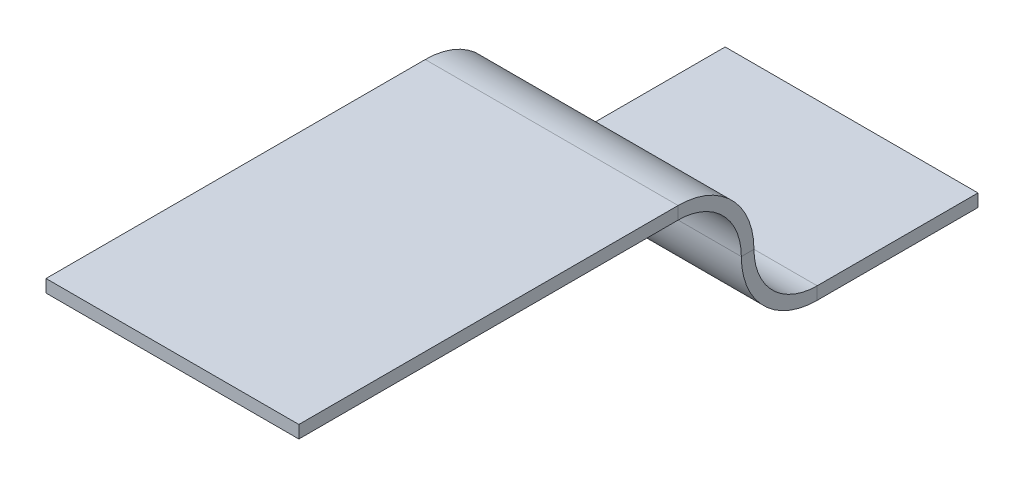
ISO-10303-21;
HEADER;
FILE_DESCRIPTION(('STEP AP214'),'2;1');
FILE_NAME('part.step','',(''),(''),'','','');
FILE_SCHEMA(('AUTOMOTIVE_DESIGN { 1 0 10303 214 1 1 1 1 }'));
ENDSEC;
DATA;
#1=APPLICATION_CONTEXT('core data for automotive mechanical design processes');
#2=APPLICATION_PROTOCOL_DEFINITION('international standard','automotive_design',2000,#1);
#3=PRODUCT_CONTEXT('',#1,'mechanical');
#4=PRODUCT('Part','Part','',(#3));
#5=PRODUCT_RELATED_PRODUCT_CATEGORY('part','',(#4));
#6=PRODUCT_DEFINITION_FORMATION('','',#4);
#7=PRODUCT_DEFINITION_CONTEXT('part definition',#1,'design');
#8=PRODUCT_DEFINITION('design','',#6,#7);
#9=PRODUCT_DEFINITION_SHAPE('','',#8);
#10=(LENGTH_UNIT() NAMED_UNIT(*) SI_UNIT(.MILLI.,.METRE.));
#11=(NAMED_UNIT(*) PLANE_ANGLE_UNIT() SI_UNIT($,.RADIAN.));
#12=(NAMED_UNIT(*) SI_UNIT($,.STERADIAN.) SOLID_ANGLE_UNIT());
#13=UNCERTAINTY_MEASURE_WITH_UNIT(LENGTH_MEASURE(1.E-05),#10,'distance_accuracy_value','');
#14=(GEOMETRIC_REPRESENTATION_CONTEXT(3) GLOBAL_UNCERTAINTY_ASSIGNED_CONTEXT((#13)) GLOBAL_UNIT_ASSIGNED_CONTEXT((#10,
#11,#12)) REPRESENTATION_CONTEXT('',''));
#15=CARTESIAN_POINT('',(0.,0.,0.));
#16=DIRECTION('',(0.,0.,1.));
#17=DIRECTION('',(1.,0.,0.));
#18=AXIS2_PLACEMENT_3D('',#15,#16,#17);
#19=CARTESIAN_POINT('',(-12.9328621908127,-1.,25.2296819787986));
#20=DIRECTION('',(0.,0.,1.));
#21=DIRECTION('',(1.,0.,0.));
#22=AXIS2_PLACEMENT_3D('',#19,#20,#21);
#23=PLANE('',#22);
#24=DIRECTION('',(1.,0.,0.));
#25=VECTOR('',#24,1.);
#26=CARTESIAN_POINT('',(-12.9328621908127,0.,25.2296819787986));
#27=LINE('',#26,#25);
#28=CARTESIAN_POINT('',(-12.9328621908127,0.,25.2296819787986));
#29=VERTEX_POINT('',#28);
#30=CARTESIAN_POINT('',(7.06713780918728,0.,25.2296819787986));
#31=VERTEX_POINT('',#30);
#32=EDGE_CURVE('E193',#29,#31,#27,.T.);
#33=ORIENTED_EDGE('',*,*,#32,.F.);
#34=DIRECTION('',(0.,1.,0.));
#35=VECTOR('',#34,1.);
#36=CARTESIAN_POINT('',(-12.9328621908127,-1.,25.2296819787986));
#37=LINE('',#36,#35);
#38=CARTESIAN_POINT('',(-12.9328621908127,-1.,25.2296819787986));
#39=VERTEX_POINT('',#38);
#40=EDGE_CURVE('E187',#39,#29,#37,.T.);
#41=ORIENTED_EDGE('',*,*,#40,.F.);
#42=DIRECTION('',(1.,0.,0.));
#43=VECTOR('',#42,1.);
#44=CARTESIAN_POINT('',(-12.9328621908127,-1.,25.2296819787986));
#45=LINE('',#44,#43);
#46=CARTESIAN_POINT('',(7.06713780918728,-1.,25.2296819787986));
#47=VERTEX_POINT('',#46);
#48=EDGE_CURVE('E212',#39,#47,#45,.T.);
#49=ORIENTED_EDGE('',*,*,#48,.T.);
#50=DIRECTION('',(0.,1.,0.));
#51=VECTOR('',#50,1.);
#52=CARTESIAN_POINT('',(7.06713780918728,-1.,25.2296819787986));
#53=LINE('',#52,#51);
#54=EDGE_CURVE('E210',#47,#31,#53,.T.);
#55=ORIENTED_EDGE('',*,*,#54,.T.);
#56=EDGE_LOOP('',(#33,#41,#49,#55));
#57=FACE_BOUND('',#56,.T.);
#58=ADVANCED_FACE('F45',(#57),#23,.T.);
#59=CARTESIAN_POINT('',(0.,-1.,0.));
#60=DIRECTION('',(0.,1.,0.));
#61=DIRECTION('',(0.,0.,1.));
#62=AXIS2_PLACEMENT_3D('',#59,#60,#61);
#63=PLANE('',#62);
#64=DIRECTION('',(-1.,0.,0.));
#65=VECTOR('',#64,1.);
#66=CARTESIAN_POINT('',(0.,-1.,-4.77031802120141));
#67=LINE('',#66,#65);
#68=CARTESIAN_POINT('',(7.06713780918726,-0.999999999999999,-4.77031802120142));
#69=VERTEX_POINT('',#68);
#70=CARTESIAN_POINT('',(-12.9328621908127,-1.,-4.77031802120141));
#71=VERTEX_POINT('',#70);
#72=EDGE_CURVE('E96',#69,#71,#67,.T.);
#73=ORIENTED_EDGE('',*,*,#72,.F.);
#74=DIRECTION('',(0.,0.,-1.));
#75=VECTOR('',#74,1.);
#76=CARTESIAN_POINT('',(7.06713780918727,-1.,-34.7703180212014));
#77=LINE('',#76,#75);
#78=EDGE_CURVE('E207',#47,#69,#77,.T.);
#79=ORIENTED_EDGE('',*,*,#78,.F.);
#80=ORIENTED_EDGE('',*,*,#48,.F.);
#81=DIRECTION('',(0.,0.,1.));
#82=VECTOR('',#81,1.);
#83=CARTESIAN_POINT('',(-12.9328621908127,-1.,-34.7703180212014));
#84=LINE('',#83,#82);
#85=EDGE_CURVE('E69',#71,#39,#84,.T.);
#86=ORIENTED_EDGE('',*,*,#85,.F.);
#87=EDGE_LOOP('',(#73,#79,#80,#86));
#88=FACE_BOUND('',#87,.T.);
#89=ADVANCED_FACE('F244',(#88),#63,.F.);
#90=CARTESIAN_POINT('',(7.06713780918727,-1.,-34.7703180212014));
#91=DIRECTION('',(1.,0.,0.));
#92=DIRECTION('',(0.,0.,-1.));
#93=AXIS2_PLACEMENT_3D('',#90,#91,#92);
#94=PLANE('',#93);
#95=ORIENTED_EDGE('',*,*,#78,.T.);
#96=DIRECTION('',(0.,1.,0.));
#97=VECTOR('',#96,1.);
#98=CARTESIAN_POINT('',(7.06713780918727,-0.999999999999998,-4.77031802120141));
#99=LINE('',#98,#97);
#100=CARTESIAN_POINT('',(7.06713780918727,0.,-4.77031802120141));
#101=VERTEX_POINT('',#100);
#102=EDGE_CURVE('E204',#69,#101,#99,.T.);
#103=ORIENTED_EDGE('',*,*,#102,.T.);
#104=DIRECTION('',(0.,0.,-1.));
#105=VECTOR('',#104,1.);
#106=CARTESIAN_POINT('',(7.06713780918727,0.,-34.7703180212014));
#107=LINE('',#106,#105);
#108=EDGE_CURVE('E201',#31,#101,#107,.T.);
#109=ORIENTED_EDGE('',*,*,#108,.F.);
#110=ORIENTED_EDGE('',*,*,#54,.F.);
#111=EDGE_LOOP('',(#95,#103,#109,#110));
#112=FACE_BOUND('',#111,.T.);
#113=ADVANCED_FACE('F237',(#112),#94,.T.);
#114=CARTESIAN_POINT('',(0.,0.,0.));
#115=DIRECTION('',(0.,1.,0.));
#116=DIRECTION('',(0.,0.,1.));
#117=AXIS2_PLACEMENT_3D('',#114,#115,#116);
#118=PLANE('',#117);
#119=ORIENTED_EDGE('',*,*,#108,.T.);
#120=DIRECTION('',(-1.,0.,0.));
#121=VECTOR('',#120,1.);
#122=CARTESIAN_POINT('',(0.,0.,-4.77031802120141));
#123=LINE('',#122,#121);
#124=CARTESIAN_POINT('',(-12.9328621908127,0.,-4.77031802120141));
#125=VERTEX_POINT('',#124);
#126=EDGE_CURVE('E198',#101,#125,#123,.T.);
#127=ORIENTED_EDGE('',*,*,#126,.T.);
#128=DIRECTION('',(0.,0.,1.));
#129=VECTOR('',#128,1.);
#130=CARTESIAN_POINT('',(-12.9328621908127,0.,-34.7703180212014));
#131=LINE('',#130,#129);
#132=EDGE_CURVE('E196',#125,#29,#131,.T.);
#133=ORIENTED_EDGE('',*,*,#132,.T.);
#134=ORIENTED_EDGE('',*,*,#32,.T.);
#135=EDGE_LOOP('',(#119,#127,#133,#134));
#136=FACE_BOUND('',#135,.T.);
#137=ADVANCED_FACE('F234',(#136),#118,.T.);
#138=CARTESIAN_POINT('',(-12.9328621908127,-1.,-34.7703180212014));
#139=DIRECTION('',(-1.,0.,0.));
#140=DIRECTION('',(0.,0.,1.));
#141=AXIS2_PLACEMENT_3D('',#138,#139,#140);
#142=PLANE('',#141);
#143=ORIENTED_EDGE('',*,*,#132,.F.);
#144=DIRECTION('',(0.,-1.,0.));
#145=VECTOR('',#144,1.);
#146=CARTESIAN_POINT('',(-12.9328621908127,-0.999999999999998,-4.77031802120141));
#147=LINE('',#146,#145);
#148=EDGE_CURVE('E191',#125,#71,#147,.T.);
#149=ORIENTED_EDGE('',*,*,#148,.T.);
#150=ORIENTED_EDGE('',*,*,#85,.T.);
#151=ORIENTED_EDGE('',*,*,#40,.T.);
#152=EDGE_LOOP('',(#143,#149,#150,#151));
#153=FACE_BOUND('',#152,.T.);
#154=ADVANCED_FACE('F47',(#153),#142,.T.);
#155=CARTESIAN_POINT('',(7.06713780918726,-6.,-4.77031802120141));
#156=DIRECTION('',(-1.,0.,0.));
#157=DIRECTION('',(0.,0.,1.));
#158=AXIS2_PLACEMENT_3D('',#155,#156,#157);
#159=PLANE('',#158);
#160=DIRECTION('',(0.,0.,-1.));
#161=VECTOR('',#160,1.);
#162=CARTESIAN_POINT('',(7.06713780918727,-6.00000000000002,-9.77031802120142));
#163=LINE('',#162,#161);
#164=CARTESIAN_POINT('',(7.06713780918726,-6.00000000000002,-9.77031802120141));
#165=VERTEX_POINT('',#164);
#166=CARTESIAN_POINT('',(7.06713780918724,-6.00000000000002,-10.7703180212014));
#167=VERTEX_POINT('',#166);
#168=EDGE_CURVE('E12',#165,#167,#163,.T.);
#169=ORIENTED_EDGE('',*,*,#168,.T.);
#170=CARTESIAN_POINT('',(7.06713780918725,-6.,-4.77031802120141));
#171=DIRECTION('',(1.,0.,0.));
#172=DIRECTION('',(0.,0.,-1.));
#173=AXIS2_PLACEMENT_3D('',#170,#171,#172);
#174=CIRCLE('',#173,6.);
#175=EDGE_CURVE('E88',#167,#101,#174,.T.);
#176=ORIENTED_EDGE('',*,*,#175,.T.);
#177=ORIENTED_EDGE('',*,*,#102,.F.);
#178=CARTESIAN_POINT('',(7.06713780918726,-6.,-4.77031802120141));
#179=DIRECTION('',(1.,0.,0.));
#180=DIRECTION('',(0.,0.,1.));
#181=AXIS2_PLACEMENT_3D('',#178,#179,#180);
#182=CIRCLE('',#181,5.);
#183=EDGE_CURVE('E179',#165,#69,#182,.T.);
#184=ORIENTED_EDGE('',*,*,#183,.F.);
#185=EDGE_LOOP('',(#169,#176,#177,#184));
#186=FACE_BOUND('',#185,.T.);
#187=ADVANCED_FACE('F240',(#186),#159,.F.);
#188=CARTESIAN_POINT('',(-12.9328621908127,-6.,-4.77031802120141));
#189=DIRECTION('',(1.,0.,0.));
#190=DIRECTION('',(0.,0.,-1.));
#191=AXIS2_PLACEMENT_3D('',#188,#189,#190);
#192=PLANE('',#191);
#193=CARTESIAN_POINT('',(-12.9328621908127,-6.,-4.77031802120141));
#194=DIRECTION('',(1.,0.,0.));
#195=DIRECTION('',(0.,0.,-1.));
#196=AXIS2_PLACEMENT_3D('',#193,#194,#195);
#197=CIRCLE('',#196,6.);
#198=CARTESIAN_POINT('',(-12.9328621908127,-6.00000000000002,-10.7703180212014));
#199=VERTEX_POINT('',#198);
#200=EDGE_CURVE('E182',#125,#199,#197,.F.);
#201=ORIENTED_EDGE('',*,*,#200,.T.);
#202=DIRECTION('',(0.,0.,1.));
#203=VECTOR('',#202,1.);
#204=CARTESIAN_POINT('',(-12.9328621908127,-6.00000000000002,-9.77031802120142));
#205=LINE('',#204,#203);
#206=CARTESIAN_POINT('',(-12.9328621908127,-6.00000000000002,-9.77031802120141));
#207=VERTEX_POINT('',#206);
#208=EDGE_CURVE('E217',#199,#207,#205,.T.);
#209=ORIENTED_EDGE('',*,*,#208,.T.);
#210=CARTESIAN_POINT('',(-12.9328621908127,-6.,-4.77031802120141));
#211=DIRECTION('',(-1.,0.,0.));
#212=DIRECTION('',(0.,0.,-1.));
#213=AXIS2_PLACEMENT_3D('',#210,#211,#212);
#214=CIRCLE('',#213,5.);
#215=EDGE_CURVE('E181',#71,#207,#214,.T.);
#216=ORIENTED_EDGE('',*,*,#215,.F.);
#217=ORIENTED_EDGE('',*,*,#148,.F.);
#218=EDGE_LOOP('',(#201,#209,#216,#217));
#219=FACE_BOUND('',#218,.T.);
#220=ADVANCED_FACE('F231',(#219),#192,.F.);
#221=CARTESIAN_POINT('',(-24.7420089710799,-6.,-4.77031802120141));
#222=DIRECTION('',(1.,0.,0.));
#223=DIRECTION('',(0.,0.,-1.));
#224=AXIS2_PLACEMENT_3D('',#221,#222,#223);
#225=CYLINDRICAL_SURFACE('',#224,5.);
#226=ORIENTED_EDGE('',*,*,#72,.T.);
#227=ORIENTED_EDGE('',*,*,#215,.T.);
#228=DIRECTION('',(-1.,0.,0.));
#229=VECTOR('',#228,1.);
#230=CARTESIAN_POINT('',(0.,-6.00000000000002,-9.77031802120142));
#231=LINE('',#230,#229);
#232=EDGE_CURVE('E189',#165,#207,#231,.T.);
#233=ORIENTED_EDGE('',*,*,#232,.F.);
#234=ORIENTED_EDGE('',*,*,#183,.T.);
#235=EDGE_LOOP('',(#226,#227,#233,#234));
#236=FACE_BOUND('',#235,.T.);
#237=ADVANCED_FACE('F242',(#236),#225,.F.);
#238=CARTESIAN_POINT('',(-24.7420089710799,-6.,-4.77031802120141));
#239=DIRECTION('',(1.,0.,0.));
#240=DIRECTION('',(0.,0.,-1.));
#241=AXIS2_PLACEMENT_3D('',#238,#239,#240);
#242=CYLINDRICAL_SURFACE('',#241,6.);
#243=ORIENTED_EDGE('',*,*,#126,.F.);
#244=ORIENTED_EDGE('',*,*,#175,.F.);
#245=DIRECTION('',(-1.,0.,0.));
#246=VECTOR('',#245,1.);
#247=CARTESIAN_POINT('',(0.,-6.00000000000002,-10.7703180212014));
#248=LINE('',#247,#246);
#249=EDGE_CURVE('E53',#167,#199,#248,.T.);
#250=ORIENTED_EDGE('',*,*,#249,.T.);
#251=ORIENTED_EDGE('',*,*,#200,.F.);
#252=EDGE_LOOP('',(#243,#244,#250,#251));
#253=FACE_BOUND('',#252,.T.);
#254=ADVANCED_FACE('F222',(#253),#242,.T.);
#255=CARTESIAN_POINT('',(7.06713780918726,-6.00000000000004,-15.7703180212014));
#256=DIRECTION('',(1.,0.,0.));
#257=DIRECTION('',(0.,0.,-1.));
#258=AXIS2_PLACEMENT_3D('',#255,#256,#257);
#259=PLANE('',#258);
#260=DIRECTION('',(0.,1.,0.));
#261=VECTOR('',#260,1.);
#262=CARTESIAN_POINT('',(7.06713780918727,-12.,-15.7703180212014));
#263=LINE('',#262,#261);
#264=CARTESIAN_POINT('',(7.06713780918727,-12.,-15.7703180212014));
#265=VERTEX_POINT('',#264);
#266=CARTESIAN_POINT('',(7.06713780918727,-11.,-15.7703180212014));
#267=VERTEX_POINT('',#266);
#268=EDGE_CURVE('E139',#265,#267,#263,.T.);
#269=ORIENTED_EDGE('',*,*,#268,.T.);
#270=CARTESIAN_POINT('',(7.06713780918727,-6.00000000000004,-15.7703180212014));
#271=DIRECTION('',(1.,0.,0.));
#272=DIRECTION('',(0.,0.,-1.));
#273=AXIS2_PLACEMENT_3D('',#270,#271,#272);
#274=CIRCLE('',#273,5.);
#275=EDGE_CURVE('E60',#267,#167,#274,.F.);
#276=ORIENTED_EDGE('',*,*,#275,.T.);
#277=ORIENTED_EDGE('',*,*,#168,.F.);
#278=CARTESIAN_POINT('',(7.06713780918726,-6.00000000000004,-15.7703180212014));
#279=DIRECTION('',(-1.,0.,0.));
#280=DIRECTION('',(0.,0.,-1.));
#281=AXIS2_PLACEMENT_3D('',#278,#279,#280);
#282=CIRCLE('',#281,6.);
#283=EDGE_CURVE('E169',#265,#165,#282,.T.);
#284=ORIENTED_EDGE('',*,*,#283,.F.);
#285=EDGE_LOOP('',(#269,#276,#277,#284));
#286=FACE_BOUND('',#285,.T.);
#287=ADVANCED_FACE('F270',(#286),#259,.T.);
#288=CARTESIAN_POINT('',(-12.9328621908127,-6.00000000000004,-15.7703180212014));
#289=DIRECTION('',(-1.,0.,0.));
#290=DIRECTION('',(0.,0.,1.));
#291=AXIS2_PLACEMENT_3D('',#288,#289,#290);
#292=PLANE('',#291);
#293=CARTESIAN_POINT('',(-12.9328621908127,-6.00000000000004,-15.7703180212014));
#294=DIRECTION('',(1.,0.,0.));
#295=DIRECTION('',(0.,0.,-1.));
#296=AXIS2_PLACEMENT_3D('',#293,#294,#295);
#297=CIRCLE('',#296,5.);
#298=CARTESIAN_POINT('',(-12.9328621908127,-11.,-15.7703180212014));
#299=VERTEX_POINT('',#298);
#300=EDGE_CURVE('E173',#199,#299,#297,.T.);
#301=ORIENTED_EDGE('',*,*,#300,.T.);
#302=DIRECTION('',(0.,-1.,0.));
#303=VECTOR('',#302,1.);
#304=CARTESIAN_POINT('',(-12.9328621908127,-12.,-15.7703180212014));
#305=LINE('',#304,#303);
#306=CARTESIAN_POINT('',(-12.9328621908127,-12.,-15.7703180212014));
#307=VERTEX_POINT('',#306);
#308=EDGE_CURVE('E157',#299,#307,#305,.T.);
#309=ORIENTED_EDGE('',*,*,#308,.T.);
#310=CARTESIAN_POINT('',(-12.9328621908127,-6.00000000000004,-15.7703180212014));
#311=DIRECTION('',(1.,0.,0.));
#312=DIRECTION('',(0.,0.,1.));
#313=AXIS2_PLACEMENT_3D('',#310,#311,#312);
#314=CIRCLE('',#313,6.);
#315=EDGE_CURVE('E172',#207,#307,#314,.T.);
#316=ORIENTED_EDGE('',*,*,#315,.F.);
#317=ORIENTED_EDGE('',*,*,#208,.F.);
#318=EDGE_LOOP('',(#301,#309,#316,#317));
#319=FACE_BOUND('',#318,.T.);
#320=ADVANCED_FACE('F273',(#319),#292,.T.);
#321=CARTESIAN_POINT('',(-24.7420089710799,-6.00000000000004,-15.7703180212014));
#322=DIRECTION('',(1.,0.,0.));
#323=DIRECTION('',(0.,0.,-1.));
#324=AXIS2_PLACEMENT_3D('',#321,#322,#323);
#325=CYLINDRICAL_SURFACE('',#324,6.);
#326=ORIENTED_EDGE('',*,*,#232,.T.);
#327=ORIENTED_EDGE('',*,*,#315,.T.);
#328=DIRECTION('',(-1.,0.,0.));
#329=VECTOR('',#328,1.);
#330=CARTESIAN_POINT('',(0.,-12.,-15.7703180212014));
#331=LINE('',#330,#329);
#332=EDGE_CURVE('E159',#265,#307,#331,.T.);
#333=ORIENTED_EDGE('',*,*,#332,.F.);
#334=ORIENTED_EDGE('',*,*,#283,.T.);
#335=EDGE_LOOP('',(#326,#327,#333,#334));
#336=FACE_BOUND('',#335,.T.);
#337=ADVANCED_FACE('F276',(#336),#325,.T.);
#338=CARTESIAN_POINT('',(-24.7420089710799,-6.00000000000004,-15.7703180212014));
#339=DIRECTION('',(1.,0.,0.));
#340=DIRECTION('',(0.,0.,-1.));
#341=AXIS2_PLACEMENT_3D('',#338,#339,#340);
#342=CYLINDRICAL_SURFACE('',#341,5.);
#343=ORIENTED_EDGE('',*,*,#249,.F.);
#344=ORIENTED_EDGE('',*,*,#275,.F.);
#345=DIRECTION('',(-1.,0.,0.));
#346=VECTOR('',#345,1.);
#347=CARTESIAN_POINT('',(0.,-11.,-15.7703180212014));
#348=LINE('',#347,#346);
#349=EDGE_CURVE('E162',#267,#299,#348,.T.);
#350=ORIENTED_EDGE('',*,*,#349,.T.);
#351=ORIENTED_EDGE('',*,*,#300,.F.);
#352=EDGE_LOOP('',(#343,#344,#350,#351));
#353=FACE_BOUND('',#352,.T.);
#354=ADVANCED_FACE('F226',(#353),#342,.F.);
#355=CARTESIAN_POINT('',(-12.9328621908127,-12.,-28.4915584264575));
#356=DIRECTION('',(0.,0.,-1.));
#357=DIRECTION('',(-1.,0.,0.));
#358=AXIS2_PLACEMENT_3D('',#355,#356,#357);
#359=PLANE('',#358);
#360=DIRECTION('',(-1.,0.,0.));
#361=VECTOR('',#360,1.);
#362=CARTESIAN_POINT('',(-12.9328621908127,-11.,-28.4915584264575));
#363=LINE('',#362,#361);
#364=CARTESIAN_POINT('',(7.06713780918727,-11.,-28.4915584264575));
#365=VERTEX_POINT('',#364);
#366=CARTESIAN_POINT('',(-12.9328621908127,-11.,-28.4915584264575));
#367=VERTEX_POINT('',#366);
#368=EDGE_CURVE('E150',#365,#367,#363,.T.);
#369=ORIENTED_EDGE('',*,*,#368,.F.);
#370=DIRECTION('',(0.,1.,0.));
#371=VECTOR('',#370,1.);
#372=CARTESIAN_POINT('',(7.06713780918727,-12.,-28.4915584264575));
#373=LINE('',#372,#371);
#374=CARTESIAN_POINT('',(7.06713780918727,-12.,-28.4915584264575));
#375=VERTEX_POINT('',#374);
#376=EDGE_CURVE('E137',#375,#365,#373,.T.);
#377=ORIENTED_EDGE('',*,*,#376,.F.);
#378=DIRECTION('',(-1.,0.,0.));
#379=VECTOR('',#378,1.);
#380=CARTESIAN_POINT('',(-12.9328621908127,-12.,-28.4915584264575));
#381=LINE('',#380,#379);
#382=CARTESIAN_POINT('',(-12.9328621908127,-12.,-28.4915584264575));
#383=VERTEX_POINT('',#382);
#384=EDGE_CURVE('E148',#375,#383,#381,.T.);
#385=ORIENTED_EDGE('',*,*,#384,.T.);
#386=DIRECTION('',(0.,1.,0.));
#387=VECTOR('',#386,1.);
#388=CARTESIAN_POINT('',(-12.9328621908127,-12.,-28.4915584264575));
#389=LINE('',#388,#387);
#390=EDGE_CURVE('E156',#383,#367,#389,.T.);
#391=ORIENTED_EDGE('',*,*,#390,.T.);
#392=EDGE_LOOP('',(#369,#377,#385,#391));
#393=FACE_BOUND('',#392,.T.);
#394=ADVANCED_FACE('F147',(#393),#359,.T.);
#395=CARTESIAN_POINT('',(0.,-12.,6.2787595947439));
#396=DIRECTION('',(0.,1.,0.));
#397=DIRECTION('',(0.,0.,1.));
#398=AXIS2_PLACEMENT_3D('',#395,#396,#397);
#399=PLANE('',#398);
#400=DIRECTION('',(0.,0.,-1.));
#401=VECTOR('',#400,1.);
#402=CARTESIAN_POINT('',(7.06713780918727,-12.,-28.4915584264575));
#403=LINE('',#402,#401);
#404=EDGE_CURVE('E134',#265,#375,#403,.T.);
#405=ORIENTED_EDGE('',*,*,#404,.F.);
#406=ORIENTED_EDGE('',*,*,#332,.T.);
#407=DIRECTION('',(0.,0.,1.));
#408=VECTOR('',#407,1.);
#409=CARTESIAN_POINT('',(-12.9328621908127,-12.,-28.4915584264575));
#410=LINE('',#409,#408);
#411=EDGE_CURVE('E155',#383,#307,#410,.T.);
#412=ORIENTED_EDGE('',*,*,#411,.F.);
#413=ORIENTED_EDGE('',*,*,#384,.F.);
#414=EDGE_LOOP('',(#405,#406,#412,#413));
#415=FACE_BOUND('',#414,.T.);
#416=ADVANCED_FACE('F153',(#415),#399,.F.);
#417=CARTESIAN_POINT('',(-12.9328621908127,-12.,-28.4915584264575));
#418=DIRECTION('',(-1.,0.,0.));
#419=DIRECTION('',(0.,0.,1.));
#420=AXIS2_PLACEMENT_3D('',#417,#418,#419);
#421=PLANE('',#420);
#422=ORIENTED_EDGE('',*,*,#308,.F.);
#423=DIRECTION('',(0.,0.,1.));
#424=VECTOR('',#423,1.);
#425=CARTESIAN_POINT('',(-12.9328621908127,-11.,-28.4915584264575));
#426=LINE('',#425,#424);
#427=EDGE_CURVE('E143',#367,#299,#426,.T.);
#428=ORIENTED_EDGE('',*,*,#427,.F.);
#429=ORIENTED_EDGE('',*,*,#390,.F.);
#430=ORIENTED_EDGE('',*,*,#411,.T.);
#431=EDGE_LOOP('',(#422,#428,#429,#430));
#432=FACE_BOUND('',#431,.T.);
#433=ADVANCED_FACE('F289',(#432),#421,.T.);
#434=CARTESIAN_POINT('',(0.,-11.,6.2787595947439));
#435=DIRECTION('',(0.,1.,0.));
#436=DIRECTION('',(0.,0.,1.));
#437=AXIS2_PLACEMENT_3D('',#434,#435,#436);
#438=PLANE('',#437);
#439=ORIENTED_EDGE('',*,*,#349,.F.);
#440=DIRECTION('',(0.,0.,-1.));
#441=VECTOR('',#440,1.);
#442=CARTESIAN_POINT('',(7.06713780918727,-11.,-28.4915584264575));
#443=LINE('',#442,#441);
#444=EDGE_CURVE('E437',#267,#365,#443,.T.);
#445=ORIENTED_EDGE('',*,*,#444,.T.);
#446=ORIENTED_EDGE('',*,*,#368,.T.);
#447=ORIENTED_EDGE('',*,*,#427,.T.);
#448=EDGE_LOOP('',(#439,#445,#446,#447));
#449=FACE_BOUND('',#448,.T.);
#450=ADVANCED_FACE('F286',(#449),#438,.T.);
#451=CARTESIAN_POINT('',(7.06713780918727,-12.,-28.4915584264575));
#452=DIRECTION('',(1.,0.,0.));
#453=DIRECTION('',(0.,0.,-1.));
#454=AXIS2_PLACEMENT_3D('',#451,#452,#453);
#455=PLANE('',#454);
#456=ORIENTED_EDGE('',*,*,#268,.F.);
#457=ORIENTED_EDGE('',*,*,#404,.T.);
#458=ORIENTED_EDGE('',*,*,#376,.T.);
#459=ORIENTED_EDGE('',*,*,#444,.F.);
#460=EDGE_LOOP('',(#456,#457,#458,#459));
#461=FACE_BOUND('',#460,.T.);
#462=ADVANCED_FACE('F136',(#461),#455,.T.);
#463=CLOSED_SHELL('',(#58,#89,#113,#137,#154,#187,#220,#237,#254,#287,#320,#337,#354,#394,#416,
#433,#450,#462));
#464=MANIFOLD_SOLID_BREP('B2',#463);
#465=ADVANCED_BREP_SHAPE_REPRESENTATION('',(#18,#464),#14);
#466=SHAPE_DEFINITION_REPRESENTATION(#9,#465);
ENDSEC;
END-ISO-10303-21;
